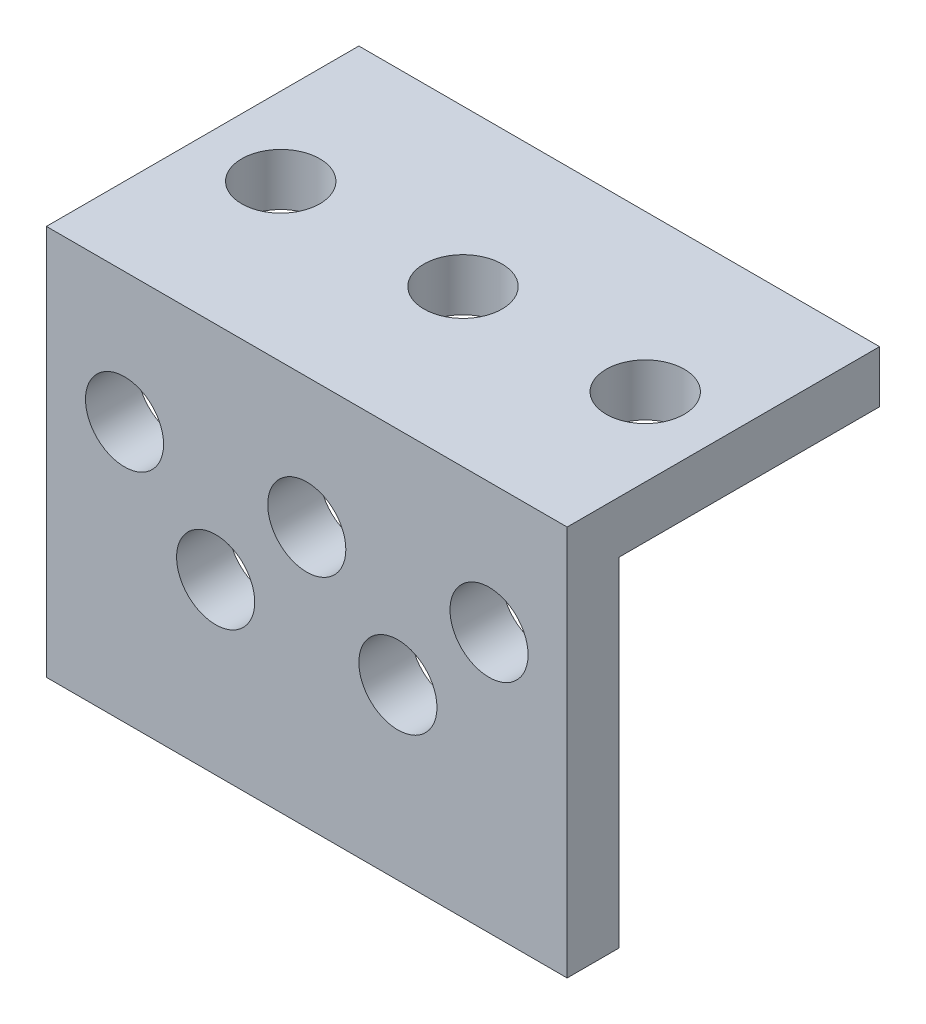
ISO-10303-21;
HEADER;
FILE_DESCRIPTION(('STEP AP214'),'2;1');
FILE_NAME('part.step','',(''),(''),'','','');
FILE_SCHEMA(('AUTOMOTIVE_DESIGN { 1 0 10303 214 1 1 1 1 }'));
ENDSEC;
DATA;
#1=APPLICATION_CONTEXT('core data for automotive mechanical design processes');
#2=APPLICATION_PROTOCOL_DEFINITION('international standard','automotive_design',2000,#1);
#3=PRODUCT_CONTEXT('',#1,'mechanical');
#4=PRODUCT('Part','Part','',(#3));
#5=PRODUCT_RELATED_PRODUCT_CATEGORY('part','',(#4));
#6=PRODUCT_DEFINITION_FORMATION('','',#4);
#7=PRODUCT_DEFINITION_CONTEXT('part definition',#1,'design');
#8=PRODUCT_DEFINITION('design','',#6,#7);
#9=PRODUCT_DEFINITION_SHAPE('','',#8);
#10=(LENGTH_UNIT() NAMED_UNIT(*) SI_UNIT(.MILLI.,.METRE.));
#11=(NAMED_UNIT(*) PLANE_ANGLE_UNIT() SI_UNIT($,.RADIAN.));
#12=(NAMED_UNIT(*) SI_UNIT($,.STERADIAN.) SOLID_ANGLE_UNIT());
#13=UNCERTAINTY_MEASURE_WITH_UNIT(LENGTH_MEASURE(1.E-05),#10,'distance_accuracy_value','');
#14=(GEOMETRIC_REPRESENTATION_CONTEXT(3) GLOBAL_UNCERTAINTY_ASSIGNED_CONTEXT((#13)) GLOBAL_UNIT_ASSIGNED_CONTEXT((#10,
#11,#12)) REPRESENTATION_CONTEXT('',''));
#15=CARTESIAN_POINT('',(0.,0.,0.));
#16=DIRECTION('',(0.,0.,1.));
#17=DIRECTION('',(1.,0.,0.));
#18=AXIS2_PLACEMENT_3D('',#15,#16,#17);
#19=CARTESIAN_POINT('',(20.,0.,-2.));
#20=DIRECTION('',(0.,0.,1.));
#21=DIRECTION('',(1.,0.,0.));
#22=AXIS2_PLACEMENT_3D('',#19,#20,#21);
#23=PLANE('',#22);
#24=DIRECTION('',(1.,0.,0.));
#25=VECTOR('',#24,1.);
#26=CARTESIAN_POINT('',(20.,13.,-2.));
#27=LINE('',#26,#25);
#28=CARTESIAN_POINT('',(20.,13.,-2.));
#29=VERTEX_POINT('',#28);
#30=CARTESIAN_POINT('',(0.,13.,-2.));
#31=VERTEX_POINT('',#30);
#32=EDGE_CURVE('E75',#29,#31,#27,.F.);
#33=ORIENTED_EDGE('',*,*,#32,.F.);
#34=DIRECTION('',(0.,1.,0.));
#35=VECTOR('',#34,1.);
#36=CARTESIAN_POINT('',(20.,0.,-2.));
#37=LINE('',#36,#35);
#38=CARTESIAN_POINT('',(20.,0.,-2.));
#39=VERTEX_POINT('',#38);
#40=EDGE_CURVE('E331',#39,#29,#37,.T.);
#41=ORIENTED_EDGE('',*,*,#40,.F.);
#42=DIRECTION('',(1.,0.,0.));
#43=VECTOR('',#42,1.);
#44=CARTESIAN_POINT('',(20.,0.,-2.));
#45=LINE('',#44,#43);
#46=CARTESIAN_POINT('',(0.,0.,-2.));
#47=VERTEX_POINT('',#46);
#48=EDGE_CURVE('E77',#39,#47,#45,.F.);
#49=ORIENTED_EDGE('',*,*,#48,.T.);
#50=DIRECTION('',(0.,1.,0.));
#51=VECTOR('',#50,1.);
#52=CARTESIAN_POINT('',(0.,0.,-2.));
#53=LINE('',#52,#51);
#54=EDGE_CURVE('E72',#47,#31,#53,.T.);
#55=ORIENTED_EDGE('',*,*,#54,.T.);
#56=EDGE_LOOP('',(#33,#41,#49,#55));
#57=FACE_BOUND('',#56,.T.);
#58=CARTESIAN_POINT('',(3.,10.,-2.));
#59=DIRECTION('',(0.,0.,1.));
#60=DIRECTION('',(1.,0.,0.));
#61=AXIS2_PLACEMENT_3D('',#58,#59,#60);
#62=CIRCLE('',#61,1.5);
#63=CARTESIAN_POINT('',(4.5,10.,-2.));
#64=VERTEX_POINT('',#63);
#65=EDGE_CURVE('E80',#64,#64,#62,.T.);
#66=ORIENTED_EDGE('',*,*,#65,.T.);
#67=EDGE_LOOP('',(#66));
#68=FACE_BOUND('',#67,.T.);
#69=CARTESIAN_POINT('',(6.5,6.5,-2.));
#70=DIRECTION('',(0.,0.,1.));
#71=DIRECTION('',(1.,0.,0.));
#72=AXIS2_PLACEMENT_3D('',#69,#70,#71);
#73=CIRCLE('',#72,1.5);
#74=CARTESIAN_POINT('',(8.,6.5,-2.));
#75=VERTEX_POINT('',#74);
#76=EDGE_CURVE('E130',#75,#75,#73,.T.);
#77=ORIENTED_EDGE('',*,*,#76,.T.);
#78=EDGE_LOOP('',(#77));
#79=FACE_BOUND('',#78,.T.);
#80=CARTESIAN_POINT('',(13.5,6.5,-2.));
#81=DIRECTION('',(0.,0.,1.));
#82=DIRECTION('',(1.,0.,0.));
#83=AXIS2_PLACEMENT_3D('',#80,#81,#82);
#84=CIRCLE('',#83,1.5);
#85=CARTESIAN_POINT('',(15.,6.5,-2.));
#86=VERTEX_POINT('',#85);
#87=EDGE_CURVE('E133',#86,#86,#84,.T.);
#88=ORIENTED_EDGE('',*,*,#87,.T.);
#89=EDGE_LOOP('',(#88));
#90=FACE_BOUND('',#89,.T.);
#91=CARTESIAN_POINT('',(17.,10.,-2.));
#92=DIRECTION('',(0.,0.,1.));
#93=DIRECTION('',(1.,0.,0.));
#94=AXIS2_PLACEMENT_3D('',#91,#92,#93);
#95=CIRCLE('',#94,1.5);
#96=CARTESIAN_POINT('',(18.5,10.,-2.));
#97=VERTEX_POINT('',#96);
#98=EDGE_CURVE('E136',#97,#97,#95,.T.);
#99=ORIENTED_EDGE('',*,*,#98,.T.);
#100=EDGE_LOOP('',(#99));
#101=FACE_BOUND('',#100,.T.);
#102=CARTESIAN_POINT('',(10.,10.,-2.));
#103=DIRECTION('',(0.,0.,1.));
#104=DIRECTION('',(1.,0.,0.));
#105=AXIS2_PLACEMENT_3D('',#102,#103,#104);
#106=CIRCLE('',#105,1.5);
#107=CARTESIAN_POINT('',(11.5,10.,-2.));
#108=VERTEX_POINT('',#107);
#109=EDGE_CURVE('E97',#108,#108,#106,.T.);
#110=ORIENTED_EDGE('',*,*,#109,.T.);
#111=EDGE_LOOP('',(#110));
#112=FACE_BOUND('',#111,.T.);
#113=ADVANCED_FACE('F17',(#57,#68,#79,#90,#101,#112),#23,.F.);
#114=CARTESIAN_POINT('',(20.,13.,0.));
#115=DIRECTION('',(0.,-1.,0.));
#116=DIRECTION('',(0.,0.,-1.));
#117=AXIS2_PLACEMENT_3D('',#114,#115,#116);
#118=PLANE('',#117);
#119=DIRECTION('',(0.,0.,-1.));
#120=VECTOR('',#119,1.);
#121=CARTESIAN_POINT('',(20.,13.,0.));
#122=LINE('',#121,#120);
#123=CARTESIAN_POINT('',(20.,13.,-12.));
#124=VERTEX_POINT('',#123);
#125=EDGE_CURVE('E85',#29,#124,#122,.T.);
#126=ORIENTED_EDGE('',*,*,#125,.F.);
#127=ORIENTED_EDGE('',*,*,#32,.T.);
#128=DIRECTION('',(0.,0.,-1.));
#129=VECTOR('',#128,1.);
#130=CARTESIAN_POINT('',(0.,13.,0.));
#131=LINE('',#130,#129);
#132=CARTESIAN_POINT('',(0.,13.,-12.));
#133=VERTEX_POINT('',#132);
#134=EDGE_CURVE('E67',#31,#133,#131,.T.);
#135=ORIENTED_EDGE('',*,*,#134,.T.);
#136=DIRECTION('',(1.,0.,0.));
#137=VECTOR('',#136,1.);
#138=CARTESIAN_POINT('',(20.,13.,-12.));
#139=LINE('',#138,#137);
#140=EDGE_CURVE('E96',#133,#124,#139,.T.);
#141=ORIENTED_EDGE('',*,*,#140,.T.);
#142=EDGE_LOOP('',(#126,#127,#135,#141));
#143=FACE_BOUND('',#142,.T.);
#144=CARTESIAN_POINT('',(3.,13.,-6.));
#145=DIRECTION('',(0.,1.,0.));
#146=DIRECTION('',(0.,0.,1.));
#147=AXIS2_PLACEMENT_3D('',#144,#145,#146);
#148=CIRCLE('',#147,1.5);
#149=CARTESIAN_POINT('',(3.,13.,-4.5));
#150=VERTEX_POINT('',#149);
#151=EDGE_CURVE('E98',#150,#150,#148,.T.);
#152=ORIENTED_EDGE('',*,*,#151,.T.);
#153=EDGE_LOOP('',(#152));
#154=FACE_BOUND('',#153,.T.);
#155=CARTESIAN_POINT('',(17.,13.,-6.));
#156=DIRECTION('',(0.,1.,0.));
#157=DIRECTION('',(0.,0.,1.));
#158=AXIS2_PLACEMENT_3D('',#155,#156,#157);
#159=CIRCLE('',#158,1.5);
#160=CARTESIAN_POINT('',(17.,13.,-4.5));
#161=VERTEX_POINT('',#160);
#162=EDGE_CURVE('E142',#161,#161,#159,.T.);
#163=ORIENTED_EDGE('',*,*,#162,.T.);
#164=EDGE_LOOP('',(#163));
#165=FACE_BOUND('',#164,.T.);
#166=CARTESIAN_POINT('',(10.,13.,-6.));
#167=DIRECTION('',(0.,1.,0.));
#168=DIRECTION('',(0.,0.,1.));
#169=AXIS2_PLACEMENT_3D('',#166,#167,#168);
#170=CIRCLE('',#169,1.5);
#171=CARTESIAN_POINT('',(10.,13.,-4.5));
#172=VERTEX_POINT('',#171);
#173=EDGE_CURVE('E20',#172,#172,#170,.T.);
#174=ORIENTED_EDGE('',*,*,#173,.T.);
#175=EDGE_LOOP('',(#174));
#176=FACE_BOUND('',#175,.T.);
#177=ADVANCED_FACE('F82',(#143,#154,#165,#176),#118,.T.);
#178=CARTESIAN_POINT('',(10.,-0.000999999999999265,-6.));
#179=DIRECTION('',(0.,1.,0.));
#180=DIRECTION('',(0.,0.,1.));
#181=AXIS2_PLACEMENT_3D('',#178,#179,#180);
#182=CYLINDRICAL_SURFACE('',#181,1.5);
#183=CARTESIAN_POINT('',(10.,15.,-6.));
#184=DIRECTION('',(0.,1.,0.));
#185=DIRECTION('',(0.,0.,1.));
#186=AXIS2_PLACEMENT_3D('',#183,#184,#185);
#187=CIRCLE('',#186,1.5);
#188=CARTESIAN_POINT('',(10.,15.,-4.5));
#189=VERTEX_POINT('',#188);
#190=EDGE_CURVE('E124',#189,#189,#187,.F.);
#191=ORIENTED_EDGE('',*,*,#190,.F.);
#192=EDGE_LOOP('',(#191));
#193=FACE_BOUND('',#192,.T.);
#194=ORIENTED_EDGE('',*,*,#173,.F.);
#195=EDGE_LOOP('',(#194));
#196=FACE_BOUND('',#195,.T.);
#197=ADVANCED_FACE('F150',(#193,#196),#182,.F.);
#198=CARTESIAN_POINT('',(17.,-0.000999999999999265,-6.));
#199=DIRECTION('',(0.,1.,0.));
#200=DIRECTION('',(0.,0.,1.));
#201=AXIS2_PLACEMENT_3D('',#198,#199,#200);
#202=CYLINDRICAL_SURFACE('',#201,1.5);
#203=CARTESIAN_POINT('',(17.,15.,-6.));
#204=DIRECTION('',(0.,1.,0.));
#205=DIRECTION('',(0.,0.,1.));
#206=AXIS2_PLACEMENT_3D('',#203,#204,#205);
#207=CIRCLE('',#206,1.5);
#208=CARTESIAN_POINT('',(17.,15.,-4.5));
#209=VERTEX_POINT('',#208);
#210=EDGE_CURVE('E121',#209,#209,#207,.F.);
#211=ORIENTED_EDGE('',*,*,#210,.F.);
#212=EDGE_LOOP('',(#211));
#213=FACE_BOUND('',#212,.T.);
#214=ORIENTED_EDGE('',*,*,#162,.F.);
#215=EDGE_LOOP('',(#214));
#216=FACE_BOUND('',#215,.T.);
#217=ADVANCED_FACE('F152',(#213,#216),#202,.F.);
#218=CARTESIAN_POINT('',(3.,-0.000999999999999265,-6.));
#219=DIRECTION('',(0.,1.,0.));
#220=DIRECTION('',(0.,0.,1.));
#221=AXIS2_PLACEMENT_3D('',#218,#219,#220);
#222=CYLINDRICAL_SURFACE('',#221,1.5);
#223=CARTESIAN_POINT('',(3.,15.,-6.));
#224=DIRECTION('',(0.,1.,0.));
#225=DIRECTION('',(0.,0.,1.));
#226=AXIS2_PLACEMENT_3D('',#223,#224,#225);
#227=CIRCLE('',#226,1.5);
#228=CARTESIAN_POINT('',(3.,15.,-4.5));
#229=VERTEX_POINT('',#228);
#230=EDGE_CURVE('E117',#229,#229,#227,.F.);
#231=ORIENTED_EDGE('',*,*,#230,.F.);
#232=EDGE_LOOP('',(#231));
#233=FACE_BOUND('',#232,.T.);
#234=ORIENTED_EDGE('',*,*,#151,.F.);
#235=EDGE_LOOP('',(#234));
#236=FACE_BOUND('',#235,.T.);
#237=ADVANCED_FACE('F160',(#233,#236),#222,.F.);
#238=CARTESIAN_POINT('',(20.,0.,-12.));
#239=DIRECTION('',(0.,0.,1.));
#240=DIRECTION('',(1.,0.,0.));
#241=AXIS2_PLACEMENT_3D('',#238,#239,#240);
#242=PLANE('',#241);
#243=DIRECTION('',(1.,0.,0.));
#244=VECTOR('',#243,1.);
#245=CARTESIAN_POINT('',(20.,15.,-12.));
#246=LINE('',#245,#244);
#247=CARTESIAN_POINT('',(20.,15.,-12.));
#248=VERTEX_POINT('',#247);
#249=CARTESIAN_POINT('',(0.,15.,-12.));
#250=VERTEX_POINT('',#249);
#251=EDGE_CURVE('E116',#248,#250,#246,.F.);
#252=ORIENTED_EDGE('',*,*,#251,.F.);
#253=DIRECTION('',(0.,1.,0.));
#254=VECTOR('',#253,1.);
#255=CARTESIAN_POINT('',(20.,0.,-12.));
#256=LINE('',#255,#254);
#257=EDGE_CURVE('E127',#124,#248,#256,.T.);
#258=ORIENTED_EDGE('',*,*,#257,.F.);
#259=ORIENTED_EDGE('',*,*,#140,.F.);
#260=DIRECTION('',(0.,1.,0.));
#261=VECTOR('',#260,1.);
#262=CARTESIAN_POINT('',(0.,0.,-12.));
#263=LINE('',#262,#261);
#264=EDGE_CURVE('E91',#133,#250,#263,.T.);
#265=ORIENTED_EDGE('',*,*,#264,.T.);
#266=EDGE_LOOP('',(#252,#258,#259,#265));
#267=FACE_BOUND('',#266,.T.);
#268=ADVANCED_FACE('F205',(#267),#242,.F.);
#269=CARTESIAN_POINT('',(10.,10.,-12.));
#270=DIRECTION('',(0.,0.,1.));
#271=DIRECTION('',(1.,0.,0.));
#272=AXIS2_PLACEMENT_3D('',#269,#270,#271);
#273=CYLINDRICAL_SURFACE('',#272,1.5);
#274=CARTESIAN_POINT('',(10.,10.,0.));
#275=DIRECTION('',(0.,0.,1.));
#276=DIRECTION('',(1.,0.,0.));
#277=AXIS2_PLACEMENT_3D('',#274,#275,#276);
#278=CIRCLE('',#277,1.5);
#279=CARTESIAN_POINT('',(11.5,10.,0.));
#280=VERTEX_POINT('',#279);
#281=EDGE_CURVE('E113',#280,#280,#278,.F.);
#282=ORIENTED_EDGE('',*,*,#281,.F.);
#283=EDGE_LOOP('',(#282));
#284=FACE_BOUND('',#283,.T.);
#285=ORIENTED_EDGE('',*,*,#109,.F.);
#286=EDGE_LOOP('',(#285));
#287=FACE_BOUND('',#286,.T.);
#288=ADVANCED_FACE('F201',(#284,#287),#273,.F.);
#289=CARTESIAN_POINT('',(17.,10.,-12.));
#290=DIRECTION('',(0.,0.,1.));
#291=DIRECTION('',(1.,0.,0.));
#292=AXIS2_PLACEMENT_3D('',#289,#290,#291);
#293=CYLINDRICAL_SURFACE('',#292,1.5);
#294=CARTESIAN_POINT('',(17.,10.,0.));
#295=DIRECTION('',(0.,0.,1.));
#296=DIRECTION('',(1.,0.,0.));
#297=AXIS2_PLACEMENT_3D('',#294,#295,#296);
#298=CIRCLE('',#297,1.5);
#299=CARTESIAN_POINT('',(18.5,10.,0.));
#300=VERTEX_POINT('',#299);
#301=EDGE_CURVE('E110',#300,#300,#298,.F.);
#302=ORIENTED_EDGE('',*,*,#301,.F.);
#303=EDGE_LOOP('',(#302));
#304=FACE_BOUND('',#303,.T.);
#305=ORIENTED_EDGE('',*,*,#98,.F.);
#306=EDGE_LOOP('',(#305));
#307=FACE_BOUND('',#306,.T.);
#308=ADVANCED_FACE('F197',(#304,#307),#293,.F.);
#309=CARTESIAN_POINT('',(13.5,6.5,-12.));
#310=DIRECTION('',(0.,0.,1.));
#311=DIRECTION('',(1.,0.,0.));
#312=AXIS2_PLACEMENT_3D('',#309,#310,#311);
#313=CYLINDRICAL_SURFACE('',#312,1.5);
#314=CARTESIAN_POINT('',(13.5,6.5,0.));
#315=DIRECTION('',(0.,0.,1.));
#316=DIRECTION('',(1.,0.,0.));
#317=AXIS2_PLACEMENT_3D('',#314,#315,#316);
#318=CIRCLE('',#317,1.5);
#319=CARTESIAN_POINT('',(15.,6.5,0.));
#320=VERTEX_POINT('',#319);
#321=EDGE_CURVE('E107',#320,#320,#318,.F.);
#322=ORIENTED_EDGE('',*,*,#321,.F.);
#323=EDGE_LOOP('',(#322));
#324=FACE_BOUND('',#323,.T.);
#325=ORIENTED_EDGE('',*,*,#87,.F.);
#326=EDGE_LOOP('',(#325));
#327=FACE_BOUND('',#326,.T.);
#328=ADVANCED_FACE('F193',(#324,#327),#313,.F.);
#329=CARTESIAN_POINT('',(6.5,6.5,-12.));
#330=DIRECTION('',(0.,0.,1.));
#331=DIRECTION('',(1.,0.,0.));
#332=AXIS2_PLACEMENT_3D('',#329,#330,#331);
#333=CYLINDRICAL_SURFACE('',#332,1.5);
#334=CARTESIAN_POINT('',(6.5,6.5,0.));
#335=DIRECTION('',(0.,0.,1.));
#336=DIRECTION('',(1.,0.,0.));
#337=AXIS2_PLACEMENT_3D('',#334,#335,#336);
#338=CIRCLE('',#337,1.5);
#339=CARTESIAN_POINT('',(8.,6.5,0.));
#340=VERTEX_POINT('',#339);
#341=EDGE_CURVE('E104',#340,#340,#338,.F.);
#342=ORIENTED_EDGE('',*,*,#341,.F.);
#343=EDGE_LOOP('',(#342));
#344=FACE_BOUND('',#343,.T.);
#345=ORIENTED_EDGE('',*,*,#76,.F.);
#346=EDGE_LOOP('',(#345));
#347=FACE_BOUND('',#346,.T.);
#348=ADVANCED_FACE('F189',(#344,#347),#333,.F.);
#349=CARTESIAN_POINT('',(3.,10.,-12.));
#350=DIRECTION('',(0.,0.,1.));
#351=DIRECTION('',(1.,0.,0.));
#352=AXIS2_PLACEMENT_3D('',#349,#350,#351);
#353=CYLINDRICAL_SURFACE('',#352,1.5);
#354=CARTESIAN_POINT('',(3.,10.,0.));
#355=DIRECTION('',(0.,0.,1.));
#356=DIRECTION('',(1.,0.,0.));
#357=AXIS2_PLACEMENT_3D('',#354,#355,#356);
#358=CIRCLE('',#357,1.5);
#359=CARTESIAN_POINT('',(4.5,10.,0.));
#360=VERTEX_POINT('',#359);
#361=EDGE_CURVE('E100',#360,#360,#358,.F.);
#362=ORIENTED_EDGE('',*,*,#361,.F.);
#363=EDGE_LOOP('',(#362));
#364=FACE_BOUND('',#363,.T.);
#365=ORIENTED_EDGE('',*,*,#65,.F.);
#366=EDGE_LOOP('',(#365));
#367=FACE_BOUND('',#366,.T.);
#368=ADVANCED_FACE('F186',(#364,#367),#353,.F.);
#369=CARTESIAN_POINT('',(0.,0.,0.));
#370=DIRECTION('',(1.,0.,0.));
#371=DIRECTION('',(0.,0.,-1.));
#372=AXIS2_PLACEMENT_3D('',#369,#370,#371);
#373=PLANE('',#372);
#374=DIRECTION('',(0.,1.,0.));
#375=VECTOR('',#374,1.);
#376=CARTESIAN_POINT('',(0.,0.,0.));
#377=LINE('',#376,#375);
#378=CARTESIAN_POINT('',(0.,15.,0.));
#379=VERTEX_POINT('',#378);
#380=CARTESIAN_POINT('',(0.,0.,0.));
#381=VERTEX_POINT('',#380);
#382=EDGE_CURVE('E103',#379,#381,#377,.F.);
#383=ORIENTED_EDGE('',*,*,#382,.F.);
#384=DIRECTION('',(0.,0.,1.));
#385=VECTOR('',#384,1.);
#386=CARTESIAN_POINT('',(0.,15.,0.));
#387=LINE('',#386,#385);
#388=EDGE_CURVE('E120',#250,#379,#387,.T.);
#389=ORIENTED_EDGE('',*,*,#388,.F.);
#390=ORIENTED_EDGE('',*,*,#264,.F.);
#391=ORIENTED_EDGE('',*,*,#134,.F.);
#392=ORIENTED_EDGE('',*,*,#54,.F.);
#393=DIRECTION('',(0.,0.,1.));
#394=VECTOR('',#393,1.);
#395=CARTESIAN_POINT('',(0.,0.,0.));
#396=LINE('',#395,#394);
#397=EDGE_CURVE('E336',#47,#381,#396,.T.);
#398=ORIENTED_EDGE('',*,*,#397,.T.);
#399=EDGE_LOOP('',(#383,#389,#390,#391,#392,#398));
#400=FACE_BOUND('',#399,.T.);
#401=ADVANCED_FACE('F89',(#400),#373,.F.);
#402=CARTESIAN_POINT('',(20.,0.,0.));
#403=DIRECTION('',(0.,1.,0.));
#404=DIRECTION('',(0.,0.,1.));
#405=AXIS2_PLACEMENT_3D('',#402,#403,#404);
#406=PLANE('',#405);
#407=ORIENTED_EDGE('',*,*,#48,.F.);
#408=DIRECTION('',(0.,0.,-1.));
#409=VECTOR('',#408,1.);
#410=CARTESIAN_POINT('',(20.,0.,0.));
#411=LINE('',#410,#409);
#412=CARTESIAN_POINT('',(20.,0.,0.));
#413=VERTEX_POINT('',#412);
#414=EDGE_CURVE('E333',#413,#39,#411,.T.);
#415=ORIENTED_EDGE('',*,*,#414,.F.);
#416=DIRECTION('',(1.,0.,0.));
#417=VECTOR('',#416,1.);
#418=CARTESIAN_POINT('',(20.,0.,0.));
#419=LINE('',#418,#417);
#420=EDGE_CURVE('E340',#381,#413,#419,.T.);
#421=ORIENTED_EDGE('',*,*,#420,.F.);
#422=ORIENTED_EDGE('',*,*,#397,.F.);
#423=EDGE_LOOP('',(#407,#415,#421,#422));
#424=FACE_BOUND('',#423,.T.);
#425=ADVANCED_FACE('F180',(#424),#406,.F.);
#426=CARTESIAN_POINT('',(20.,0.,0.));
#427=DIRECTION('',(1.,0.,0.));
#428=DIRECTION('',(0.,0.,-1.));
#429=AXIS2_PLACEMENT_3D('',#426,#427,#428);
#430=PLANE('',#429);
#431=DIRECTION('',(0.,0.,1.));
#432=VECTOR('',#431,1.);
#433=CARTESIAN_POINT('',(20.,15.,0.));
#434=LINE('',#433,#432);
#435=CARTESIAN_POINT('',(20.,15.,0.));
#436=VERTEX_POINT('',#435);
#437=EDGE_CURVE('E35',#436,#248,#434,.F.);
#438=ORIENTED_EDGE('',*,*,#437,.F.);
#439=DIRECTION('',(0.,1.,0.));
#440=VECTOR('',#439,1.);
#441=CARTESIAN_POINT('',(20.,0.,0.));
#442=LINE('',#441,#440);
#443=EDGE_CURVE('E26',#413,#436,#442,.T.);
#444=ORIENTED_EDGE('',*,*,#443,.F.);
#445=ORIENTED_EDGE('',*,*,#414,.T.);
#446=ORIENTED_EDGE('',*,*,#40,.T.);
#447=ORIENTED_EDGE('',*,*,#125,.T.);
#448=ORIENTED_EDGE('',*,*,#257,.T.);
#449=EDGE_LOOP('',(#438,#444,#445,#446,#447,#448));
#450=FACE_BOUND('',#449,.T.);
#451=ADVANCED_FACE('F172',(#450),#430,.T.);
#452=CARTESIAN_POINT('',(20.,15.,0.));
#453=DIRECTION('',(0.,1.,0.));
#454=DIRECTION('',(0.,0.,1.));
#455=AXIS2_PLACEMENT_3D('',#452,#453,#454);
#456=PLANE('',#455);
#457=ORIENTED_EDGE('',*,*,#437,.T.);
#458=ORIENTED_EDGE('',*,*,#251,.T.);
#459=ORIENTED_EDGE('',*,*,#388,.T.);
#460=DIRECTION('',(1.,0.,0.));
#461=VECTOR('',#460,1.);
#462=CARTESIAN_POINT('',(20.,15.,0.));
#463=LINE('',#462,#461);
#464=EDGE_CURVE('E11',#436,#379,#463,.F.);
#465=ORIENTED_EDGE('',*,*,#464,.F.);
#466=EDGE_LOOP('',(#457,#458,#459,#465));
#467=FACE_BOUND('',#466,.T.);
#468=ORIENTED_EDGE('',*,*,#230,.T.);
#469=EDGE_LOOP('',(#468));
#470=FACE_BOUND('',#469,.T.);
#471=ORIENTED_EDGE('',*,*,#210,.T.);
#472=EDGE_LOOP('',(#471));
#473=FACE_BOUND('',#472,.T.);
#474=ORIENTED_EDGE('',*,*,#190,.T.);
#475=EDGE_LOOP('',(#474));
#476=FACE_BOUND('',#475,.T.);
#477=ADVANCED_FACE('F166',(#467,#470,#473,#476),#456,.T.);
#478=CARTESIAN_POINT('',(20.,0.,0.));
#479=DIRECTION('',(0.,0.,1.));
#480=DIRECTION('',(1.,0.,0.));
#481=AXIS2_PLACEMENT_3D('',#478,#479,#480);
#482=PLANE('',#481);
#483=ORIENTED_EDGE('',*,*,#443,.T.);
#484=ORIENTED_EDGE('',*,*,#464,.T.);
#485=ORIENTED_EDGE('',*,*,#382,.T.);
#486=ORIENTED_EDGE('',*,*,#420,.T.);
#487=EDGE_LOOP('',(#483,#484,#485,#486));
#488=FACE_BOUND('',#487,.T.);
#489=ORIENTED_EDGE('',*,*,#361,.T.);
#490=EDGE_LOOP('',(#489));
#491=FACE_BOUND('',#490,.T.);
#492=ORIENTED_EDGE('',*,*,#341,.T.);
#493=EDGE_LOOP('',(#492));
#494=FACE_BOUND('',#493,.T.);
#495=ORIENTED_EDGE('',*,*,#321,.T.);
#496=EDGE_LOOP('',(#495));
#497=FACE_BOUND('',#496,.T.);
#498=ORIENTED_EDGE('',*,*,#301,.T.);
#499=EDGE_LOOP('',(#498));
#500=FACE_BOUND('',#499,.T.);
#501=ORIENTED_EDGE('',*,*,#281,.T.);
#502=EDGE_LOOP('',(#501));
#503=FACE_BOUND('',#502,.T.);
#504=ADVANCED_FACE('F164',(#488,#491,#494,#497,#500,#503),#482,.T.);
#505=CLOSED_SHELL('',(#113,#177,#197,#217,#237,#268,#288,#308,#328,#348,#368,#401,#425,#451,
#477,#504));
#506=MANIFOLD_SOLID_BREP('B1',#505);
#507=ADVANCED_BREP_SHAPE_REPRESENTATION('',(#18,#506),#14);
#508=SHAPE_DEFINITION_REPRESENTATION(#9,#507);
ENDSEC;
END-ISO-10303-21;
